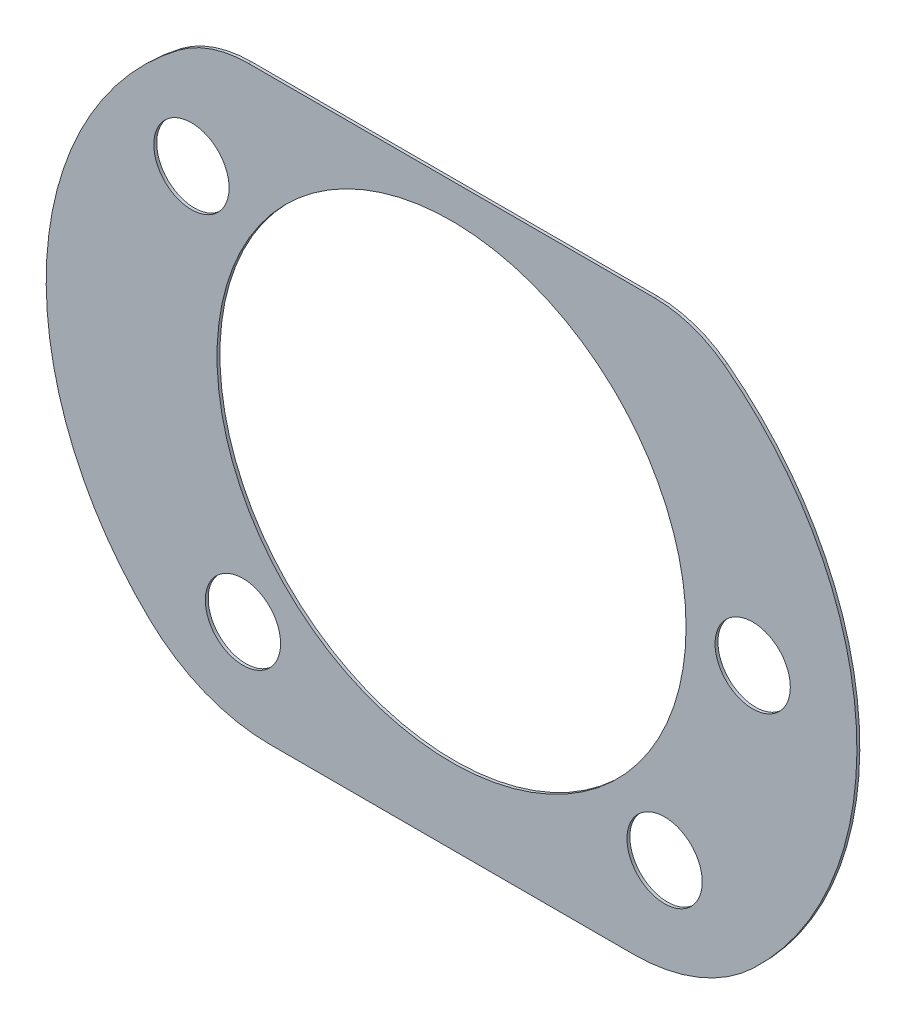
ISO-10303-21;
HEADER;
FILE_DESCRIPTION(('STEP AP214'),'2;1');
FILE_NAME('part.step','',(''),(''),'','','');
FILE_SCHEMA(('AUTOMOTIVE_DESIGN { 1 0 10303 214 1 1 1 1 }'));
ENDSEC;
DATA;
#1=APPLICATION_CONTEXT('core data for automotive mechanical design processes');
#2=APPLICATION_PROTOCOL_DEFINITION('international standard','automotive_design',2000,#1);
#3=PRODUCT_CONTEXT('',#1,'mechanical');
#4=PRODUCT('Part','Part','',(#3));
#5=PRODUCT_RELATED_PRODUCT_CATEGORY('part','',(#4));
#6=PRODUCT_DEFINITION_FORMATION('','',#4);
#7=PRODUCT_DEFINITION_CONTEXT('part definition',#1,'design');
#8=PRODUCT_DEFINITION('design','',#6,#7);
#9=PRODUCT_DEFINITION_SHAPE('','',#8);
#10=(LENGTH_UNIT() NAMED_UNIT(*) SI_UNIT(.MILLI.,.METRE.));
#11=(NAMED_UNIT(*) PLANE_ANGLE_UNIT() SI_UNIT($,.RADIAN.));
#12=(NAMED_UNIT(*) SI_UNIT($,.STERADIAN.) SOLID_ANGLE_UNIT());
#13=UNCERTAINTY_MEASURE_WITH_UNIT(LENGTH_MEASURE(1.E-05),#10,'distance_accuracy_value','');
#14=(GEOMETRIC_REPRESENTATION_CONTEXT(3) GLOBAL_UNCERTAINTY_ASSIGNED_CONTEXT((#13)) GLOBAL_UNIT_ASSIGNED_CONTEXT((#10,
#11,#12)) REPRESENTATION_CONTEXT('',''));
#15=CARTESIAN_POINT('',(0.,0.,0.));
#16=DIRECTION('',(0.,0.,1.));
#17=DIRECTION('',(1.,0.,0.));
#18=AXIS2_PLACEMENT_3D('',#15,#16,#17);
#19=CARTESIAN_POINT('',(12.3997988373471,-3.5,0.5));
#20=DIRECTION('',(0.,0.,1.));
#21=DIRECTION('',(1.,0.,0.));
#22=AXIS2_PLACEMENT_3D('',#19,#20,#21);
#23=PLANE('',#22);
#24=CARTESIAN_POINT('',(52.,0.,0.5));
#25=DIRECTION('',(0.,0.,1.));
#26=DIRECTION('',(1.,0.,0.));
#27=AXIS2_PLACEMENT_3D('',#24,#25,#26);
#28=CIRCLE('',#27,6.5);
#29=CARTESIAN_POINT('',(58.5,0.,0.5));
#30=VERTEX_POINT('',#29);
#31=EDGE_CURVE('E199',#30,#30,#28,.T.);
#32=ORIENTED_EDGE('',*,*,#31,.F.);
#33=EDGE_LOOP('',(#32));
#34=FACE_BOUND('',#33,.T.);
#35=CARTESIAN_POINT('',(-36.0242973560901,-37.5,0.5));
#36=DIRECTION('',(0.,0.,1.));
#37=DIRECTION('',(1.,0.,0.));
#38=AXIS2_PLACEMENT_3D('',#35,#36,#37);
#39=CIRCLE('',#38,6.5);
#40=CARTESIAN_POINT('',(-29.5242973560901,-37.5,0.5));
#41=VERTEX_POINT('',#40);
#42=EDGE_CURVE('E187',#41,#41,#39,.T.);
#43=ORIENTED_EDGE('',*,*,#42,.F.);
#44=EDGE_LOOP('',(#43));
#45=FACE_BOUND('',#44,.T.);
#46=CARTESIAN_POINT('',(12.3997988373471,-3.5,0.5));
#47=DIRECTION('',(0.,0.,1.));
#48=DIRECTION('',(1.,0.,0.));
#49=AXIS2_PLACEMENT_3D('',#46,#47,#48);
#50=CIRCLE('',#49,57.6);
#51=CARTESIAN_POINT('',(52.093689716507,-45.2391306434782,0.5));
#52=VERTEX_POINT('',#51);
#53=CARTESIAN_POINT('',(47.1226025392876,42.4574466553191,0.5));
#54=VERTEX_POINT('',#53);
#55=EDGE_CURVE('E150',#52,#54,#50,.T.);
#56=ORIENTED_EDGE('',*,*,#55,.T.);
#57=CARTESIAN_POINT('',(35.0660734761138,26.4999999,0.5));
#58=DIRECTION('',(0.,0.,1.));
#59=DIRECTION('',(1.,0.,0.));
#60=AXIS2_PLACEMENT_3D('',#57,#58,#59);
#61=CIRCLE('',#60,20.);
#62=CARTESIAN_POINT('',(35.0660734761138,46.4999999,0.5));
#63=VERTEX_POINT('',#62);
#64=EDGE_CURVE('E98',#54,#63,#61,.T.);
#65=ORIENTED_EDGE('',*,*,#64,.T.);
#66=DIRECTION('',(-1.,0.,0.));
#67=VECTOR('',#66,1.);
#68=CARTESIAN_POINT('',(35.0660734761138,46.4999999,0.5));
#69=LINE('',#68,#67);
#70=CARTESIAN_POINT('',(-35.0660734761138,46.4999999,0.5));
#71=VERTEX_POINT('',#70);
#72=EDGE_CURVE('E165',#63,#71,#69,.T.);
#73=ORIENTED_EDGE('',*,*,#72,.T.);
#74=CARTESIAN_POINT('',(-35.0660734761137,26.4965587331368,0.5));
#75=DIRECTION('',(0.,0.,1.));
#76=DIRECTION('',(1.,0.,0.));
#77=AXIS2_PLACEMENT_3D('',#74,#75,#76);
#78=CIRCLE('',#77,20.0034411668632);
#79=CARTESIAN_POINT('',(-47.1255088583811,42.4561225359816,0.5));
#80=VERTEX_POINT('',#79);
#81=EDGE_CURVE('E178',#71,#80,#78,.T.);
#82=ORIENTED_EDGE('',*,*,#81,.T.);
#83=CARTESIAN_POINT('',(-12.4003097176812,-3.49951416550181,0.5));
#84=DIRECTION('',(0.,0.,1.));
#85=DIRECTION('',(1.,0.,0.));
#86=AXIS2_PLACEMENT_3D('',#83,#84,#85);
#87=CIRCLE('',#86,57.6);
#88=CARTESIAN_POINT('',(-52.093134411796,-45.2396587244545,0.5));
#89=VERTEX_POINT('',#88);
#90=EDGE_CURVE('E117',#80,#89,#87,.T.);
#91=ORIENTED_EDGE('',*,*,#90,.T.);
#92=CARTESIAN_POINT('',(-31.4197882169445,-23.5000001,0.5));
#93=DIRECTION('',(0.,0.,1.));
#94=DIRECTION('',(1.,0.,0.));
#95=AXIS2_PLACEMENT_3D('',#92,#93,#94);
#96=CIRCLE('',#95,30.);
#97=CARTESIAN_POINT('',(-31.4197882169445,-53.5000001,0.5));
#98=VERTEX_POINT('',#97);
#99=EDGE_CURVE('E111',#89,#98,#96,.T.);
#100=ORIENTED_EDGE('',*,*,#99,.T.);
#101=DIRECTION('',(1.,0.,0.));
#102=VECTOR('',#101,1.);
#103=CARTESIAN_POINT('',(-31.4197882169445,-53.5000001,0.5));
#104=LINE('',#103,#102);
#105=CARTESIAN_POINT('',(31.4197882169446,-53.5000001,0.5));
#106=VERTEX_POINT('',#105);
#107=EDGE_CURVE('E115',#98,#106,#104,.T.);
#108=ORIENTED_EDGE('',*,*,#107,.T.);
#109=CARTESIAN_POINT('',(31.4197882169446,-23.5000001,0.5));
#110=DIRECTION('',(0.,0.,1.));
#111=DIRECTION('',(1.,0.,0.));
#112=AXIS2_PLACEMENT_3D('',#109,#110,#111);
#113=CIRCLE('',#112,30.);
#114=EDGE_CURVE('E55',#106,#52,#113,.T.);
#115=ORIENTED_EDGE('',*,*,#114,.T.);
#116=EDGE_LOOP('',(#56,#65,#73,#82,#91,#100,#108,#115));
#117=FACE_BOUND('',#116,.T.);
#118=CARTESIAN_POINT('',(-44.9172572626602,26.2,0.5));
#119=DIRECTION('',(0.,0.,1.));
#120=DIRECTION('',(1.,0.,0.));
#121=AXIS2_PLACEMENT_3D('',#118,#119,#120);
#122=CIRCLE('',#121,6.5);
#123=CARTESIAN_POINT('',(-38.4172572626602,26.2,0.5));
#124=VERTEX_POINT('',#123);
#125=EDGE_CURVE('E139',#124,#124,#122,.T.);
#126=ORIENTED_EDGE('',*,*,#125,.F.);
#127=EDGE_LOOP('',(#126));
#128=FACE_BOUND('',#127,.T.);
#129=CARTESIAN_POINT('',(36.7890948515997,-36.75,0.5));
#130=DIRECTION('',(0.,0.,1.));
#131=DIRECTION('',(1.,0.,0.));
#132=AXIS2_PLACEMENT_3D('',#129,#130,#131);
#133=CIRCLE('',#132,6.5);
#134=CARTESIAN_POINT('',(43.2890948515997,-36.75,0.5));
#135=VERTEX_POINT('',#134);
#136=EDGE_CURVE('E193',#135,#135,#133,.T.);
#137=ORIENTED_EDGE('',*,*,#136,.F.);
#138=EDGE_LOOP('',(#137));
#139=FACE_BOUND('',#138,.T.);
#140=CARTESIAN_POINT('',(0.,0.,0.5));
#141=DIRECTION('',(0.,0.,1.));
#142=DIRECTION('',(1.,0.,0.));
#143=AXIS2_PLACEMENT_3D('',#140,#141,#142);
#144=CIRCLE('',#143,40.5);
#145=CARTESIAN_POINT('',(40.5,0.,0.5));
#146=VERTEX_POINT('',#145);
#147=EDGE_CURVE('E205',#146,#146,#144,.T.);
#148=ORIENTED_EDGE('',*,*,#147,.F.);
#149=EDGE_LOOP('',(#148));
#150=FACE_BOUND('',#149,.T.);
#151=ADVANCED_FACE('F38',(#34,#45,#117,#128,#139,#150),#23,.T.);
#152=CARTESIAN_POINT('',(12.3997988373471,-3.5,0.));
#153=DIRECTION('',(0.,0.,1.));
#154=DIRECTION('',(1.,0.,0.));
#155=AXIS2_PLACEMENT_3D('',#152,#153,#154);
#156=PLANE('',#155);
#157=CARTESIAN_POINT('',(12.3997988373471,-3.5,0.));
#158=DIRECTION('',(0.,0.,1.));
#159=DIRECTION('',(1.,0.,0.));
#160=AXIS2_PLACEMENT_3D('',#157,#158,#159);
#161=CIRCLE('',#160,57.6);
#162=CARTESIAN_POINT('',(52.093689716507,-45.2391306434782,0.));
#163=VERTEX_POINT('',#162);
#164=CARTESIAN_POINT('',(47.1226025392876,42.4574466553191,0.));
#165=VERTEX_POINT('',#164);
#166=EDGE_CURVE('E135',#163,#165,#161,.T.);
#167=ORIENTED_EDGE('',*,*,#166,.F.);
#168=CARTESIAN_POINT('',(31.4197882169446,-23.5000001,0.));
#169=DIRECTION('',(0.,0.,1.));
#170=DIRECTION('',(1.,0.,0.));
#171=AXIS2_PLACEMENT_3D('',#168,#169,#170);
#172=CIRCLE('',#171,30.);
#173=CARTESIAN_POINT('',(31.4197882169446,-53.5000001,0.));
#174=VERTEX_POINT('',#173);
#175=EDGE_CURVE('E90',#174,#163,#172,.T.);
#176=ORIENTED_EDGE('',*,*,#175,.F.);
#177=DIRECTION('',(1.,0.,0.));
#178=VECTOR('',#177,1.);
#179=CARTESIAN_POINT('',(-31.4197882169445,-53.5000001,0.));
#180=LINE('',#179,#178);
#181=CARTESIAN_POINT('',(-31.4197882169445,-53.5000001,0.));
#182=VERTEX_POINT('',#181);
#183=EDGE_CURVE('E84',#182,#174,#180,.T.);
#184=ORIENTED_EDGE('',*,*,#183,.F.);
#185=CARTESIAN_POINT('',(-31.4197882169445,-23.5000001,0.));
#186=DIRECTION('',(0.,0.,1.));
#187=DIRECTION('',(1.,0.,0.));
#188=AXIS2_PLACEMENT_3D('',#185,#186,#187);
#189=CIRCLE('',#188,30.);
#190=CARTESIAN_POINT('',(-52.093134411796,-45.2396587244545,0.));
#191=VERTEX_POINT('',#190);
#192=EDGE_CURVE('E125',#191,#182,#189,.T.);
#193=ORIENTED_EDGE('',*,*,#192,.F.);
#194=CARTESIAN_POINT('',(-12.4003097176812,-3.49951416550181,0.));
#195=DIRECTION('',(0.,0.,1.));
#196=DIRECTION('',(1.,0.,0.));
#197=AXIS2_PLACEMENT_3D('',#194,#195,#196);
#198=CIRCLE('',#197,57.6);
#199=CARTESIAN_POINT('',(-47.1255088583811,42.4561225359816,0.));
#200=VERTEX_POINT('',#199);
#201=EDGE_CURVE('E145',#200,#191,#198,.T.);
#202=ORIENTED_EDGE('',*,*,#201,.F.);
#203=CARTESIAN_POINT('',(-35.0660734761137,26.4965587331368,0.));
#204=DIRECTION('',(0.,0.,1.));
#205=DIRECTION('',(1.,0.,0.));
#206=AXIS2_PLACEMENT_3D('',#203,#204,#205);
#207=CIRCLE('',#206,20.0034411668632);
#208=CARTESIAN_POINT('',(-35.0660734761138,46.4999999,0.));
#209=VERTEX_POINT('',#208);
#210=EDGE_CURVE('E143',#209,#200,#207,.T.);
#211=ORIENTED_EDGE('',*,*,#210,.F.);
#212=DIRECTION('',(-1.,0.,0.));
#213=VECTOR('',#212,1.);
#214=CARTESIAN_POINT('',(35.0660734761138,46.4999999,0.));
#215=LINE('',#214,#213);
#216=CARTESIAN_POINT('',(35.0660734761138,46.4999999,0.));
#217=VERTEX_POINT('',#216);
#218=EDGE_CURVE('E141',#217,#209,#215,.T.);
#219=ORIENTED_EDGE('',*,*,#218,.F.);
#220=CARTESIAN_POINT('',(35.0660734761138,26.4999999,0.));
#221=DIRECTION('',(0.,0.,1.));
#222=DIRECTION('',(1.,0.,0.));
#223=AXIS2_PLACEMENT_3D('',#220,#221,#222);
#224=CIRCLE('',#223,20.);
#225=EDGE_CURVE('E138',#165,#217,#224,.T.);
#226=ORIENTED_EDGE('',*,*,#225,.F.);
#227=EDGE_LOOP('',(#167,#176,#184,#193,#202,#211,#219,#226));
#228=FACE_BOUND('',#227,.T.);
#229=CARTESIAN_POINT('',(-44.9172572626602,26.2,0.));
#230=DIRECTION('',(0.,0.,1.));
#231=DIRECTION('',(1.,0.,0.));
#232=AXIS2_PLACEMENT_3D('',#229,#230,#231);
#233=CIRCLE('',#232,6.5);
#234=CARTESIAN_POINT('',(-38.4172572626602,26.2,0.));
#235=VERTEX_POINT('',#234);
#236=EDGE_CURVE('E184',#235,#235,#233,.T.);
#237=ORIENTED_EDGE('',*,*,#236,.T.);
#238=EDGE_LOOP('',(#237));
#239=FACE_BOUND('',#238,.T.);
#240=CARTESIAN_POINT('',(-36.0242973560901,-37.5,0.));
#241=DIRECTION('',(0.,0.,1.));
#242=DIRECTION('',(1.,0.,0.));
#243=AXIS2_PLACEMENT_3D('',#240,#241,#242);
#244=CIRCLE('',#243,6.5);
#245=CARTESIAN_POINT('',(-29.5242973560901,-37.5,0.));
#246=VERTEX_POINT('',#245);
#247=EDGE_CURVE('E190',#246,#246,#244,.T.);
#248=ORIENTED_EDGE('',*,*,#247,.T.);
#249=EDGE_LOOP('',(#248));
#250=FACE_BOUND('',#249,.T.);
#251=CARTESIAN_POINT('',(36.7890948515997,-36.75,0.));
#252=DIRECTION('',(0.,0.,1.));
#253=DIRECTION('',(1.,0.,0.));
#254=AXIS2_PLACEMENT_3D('',#251,#252,#253);
#255=CIRCLE('',#254,6.5);
#256=CARTESIAN_POINT('',(43.2890948515997,-36.75,0.));
#257=VERTEX_POINT('',#256);
#258=EDGE_CURVE('E196',#257,#257,#255,.T.);
#259=ORIENTED_EDGE('',*,*,#258,.T.);
#260=EDGE_LOOP('',(#259));
#261=FACE_BOUND('',#260,.T.);
#262=CARTESIAN_POINT('',(52.,0.,0.));
#263=DIRECTION('',(0.,0.,1.));
#264=DIRECTION('',(1.,0.,0.));
#265=AXIS2_PLACEMENT_3D('',#262,#263,#264);
#266=CIRCLE('',#265,6.5);
#267=CARTESIAN_POINT('',(58.5,0.,0.));
#268=VERTEX_POINT('',#267);
#269=EDGE_CURVE('E202',#268,#268,#266,.T.);
#270=ORIENTED_EDGE('',*,*,#269,.T.);
#271=EDGE_LOOP('',(#270));
#272=FACE_BOUND('',#271,.T.);
#273=CARTESIAN_POINT('',(0.,0.,0.));
#274=DIRECTION('',(0.,0.,1.));
#275=DIRECTION('',(1.,0.,0.));
#276=AXIS2_PLACEMENT_3D('',#273,#274,#275);
#277=CIRCLE('',#276,40.5);
#278=CARTESIAN_POINT('',(40.5,0.,0.));
#279=VERTEX_POINT('',#278);
#280=EDGE_CURVE('E208',#279,#279,#277,.T.);
#281=ORIENTED_EDGE('',*,*,#280,.T.);
#282=EDGE_LOOP('',(#281));
#283=FACE_BOUND('',#282,.T.);
#284=ADVANCED_FACE('F169',(#228,#239,#250,#261,#272,#283),#156,.F.);
#285=CARTESIAN_POINT('',(12.3997988373471,-3.5,0.5));
#286=DIRECTION('',(0.,0.,-1.));
#287=DIRECTION('',(-1.,0.,0.));
#288=AXIS2_PLACEMENT_3D('',#285,#286,#287);
#289=CYLINDRICAL_SURFACE('',#288,57.6);
#290=ORIENTED_EDGE('',*,*,#166,.T.);
#291=DIRECTION('',(0.,0.,-1.));
#292=VECTOR('',#291,1.);
#293=CARTESIAN_POINT('',(47.1226025392876,42.4574466553191,0.5));
#294=LINE('',#293,#292);
#295=EDGE_CURVE('E11',#54,#165,#294,.T.);
#296=ORIENTED_EDGE('',*,*,#295,.F.);
#297=ORIENTED_EDGE('',*,*,#55,.F.);
#298=DIRECTION('',(0.,0.,-1.));
#299=VECTOR('',#298,1.);
#300=CARTESIAN_POINT('',(52.093689716507,-45.2391306434782,0.5));
#301=LINE('',#300,#299);
#302=EDGE_CURVE('E131',#52,#163,#301,.T.);
#303=ORIENTED_EDGE('',*,*,#302,.T.);
#304=EDGE_LOOP('',(#290,#296,#297,#303));
#305=FACE_BOUND('',#304,.T.);
#306=ADVANCED_FACE('F40',(#305),#289,.T.);
#307=CARTESIAN_POINT('',(35.0660734761138,26.4999999,0.5));
#308=DIRECTION('',(0.,0.,-1.));
#309=DIRECTION('',(-1.,0.,0.));
#310=AXIS2_PLACEMENT_3D('',#307,#308,#309);
#311=CYLINDRICAL_SURFACE('',#310,20.);
#312=ORIENTED_EDGE('',*,*,#225,.T.);
#313=DIRECTION('',(0.,0.,-1.));
#314=VECTOR('',#313,1.);
#315=CARTESIAN_POINT('',(35.0660734761138,46.4999999,0.5));
#316=LINE('',#315,#314);
#317=EDGE_CURVE('E47',#63,#217,#316,.T.);
#318=ORIENTED_EDGE('',*,*,#317,.F.);
#319=ORIENTED_EDGE('',*,*,#64,.F.);
#320=ORIENTED_EDGE('',*,*,#295,.T.);
#321=EDGE_LOOP('',(#312,#318,#319,#320));
#322=FACE_BOUND('',#321,.T.);
#323=ADVANCED_FACE('F242',(#322),#311,.T.);
#324=CARTESIAN_POINT('',(35.0660734761138,46.4999999,0.5));
#325=DIRECTION('',(0.,-1.,0.));
#326=DIRECTION('',(1.,0.,0.));
#327=AXIS2_PLACEMENT_3D('',#324,#325,#326);
#328=PLANE('',#327);
#329=ORIENTED_EDGE('',*,*,#218,.T.);
#330=DIRECTION('',(0.,0.,-1.));
#331=VECTOR('',#330,1.);
#332=CARTESIAN_POINT('',(-35.0660734761138,46.4999999,0.5));
#333=LINE('',#332,#331);
#334=EDGE_CURVE('E157',#71,#209,#333,.T.);
#335=ORIENTED_EDGE('',*,*,#334,.F.);
#336=ORIENTED_EDGE('',*,*,#72,.F.);
#337=ORIENTED_EDGE('',*,*,#317,.T.);
#338=EDGE_LOOP('',(#329,#335,#336,#337));
#339=FACE_BOUND('',#338,.T.);
#340=ADVANCED_FACE('F163',(#339),#328,.F.);
#341=CARTESIAN_POINT('',(-35.0660734761137,26.4965587331368,0.5));
#342=DIRECTION('',(0.,0.,-1.));
#343=DIRECTION('',(-1.,0.,0.));
#344=AXIS2_PLACEMENT_3D('',#341,#342,#343);
#345=CYLINDRICAL_SURFACE('',#344,20.0034411668632);
#346=ORIENTED_EDGE('',*,*,#210,.T.);
#347=DIRECTION('',(0.,0.,-1.));
#348=VECTOR('',#347,1.);
#349=CARTESIAN_POINT('',(-47.1255088583811,42.4561225359816,0.5));
#350=LINE('',#349,#348);
#351=EDGE_CURVE('E154',#80,#200,#350,.T.);
#352=ORIENTED_EDGE('',*,*,#351,.F.);
#353=ORIENTED_EDGE('',*,*,#81,.F.);
#354=ORIENTED_EDGE('',*,*,#334,.T.);
#355=EDGE_LOOP('',(#346,#352,#353,#354));
#356=FACE_BOUND('',#355,.T.);
#357=ADVANCED_FACE('F174',(#356),#345,.T.);
#358=CARTESIAN_POINT('',(-12.4003097176812,-3.49951416550181,0.5));
#359=DIRECTION('',(0.,0.,-1.));
#360=DIRECTION('',(-1.,0.,0.));
#361=AXIS2_PLACEMENT_3D('',#358,#359,#360);
#362=CYLINDRICAL_SURFACE('',#361,57.6);
#363=ORIENTED_EDGE('',*,*,#201,.T.);
#364=DIRECTION('',(0.,0.,-1.));
#365=VECTOR('',#364,1.);
#366=CARTESIAN_POINT('',(-52.093134411796,-45.2396587244545,0.5));
#367=LINE('',#366,#365);
#368=EDGE_CURVE('E126',#89,#191,#367,.T.);
#369=ORIENTED_EDGE('',*,*,#368,.F.);
#370=ORIENTED_EDGE('',*,*,#90,.F.);
#371=ORIENTED_EDGE('',*,*,#351,.T.);
#372=EDGE_LOOP('',(#363,#369,#370,#371));
#373=FACE_BOUND('',#372,.T.);
#374=ADVANCED_FACE('F177',(#373),#362,.T.);
#375=CARTESIAN_POINT('',(-31.4197882169445,-23.5000001,0.5));
#376=DIRECTION('',(0.,0.,-1.));
#377=DIRECTION('',(-1.,0.,0.));
#378=AXIS2_PLACEMENT_3D('',#375,#376,#377);
#379=CYLINDRICAL_SURFACE('',#378,30.);
#380=ORIENTED_EDGE('',*,*,#192,.T.);
#381=DIRECTION('',(0.,0.,-1.));
#382=VECTOR('',#381,1.);
#383=CARTESIAN_POINT('',(-31.4197882169445,-53.5000001,0.5));
#384=LINE('',#383,#382);
#385=EDGE_CURVE('E122',#98,#182,#384,.T.);
#386=ORIENTED_EDGE('',*,*,#385,.F.);
#387=ORIENTED_EDGE('',*,*,#99,.F.);
#388=ORIENTED_EDGE('',*,*,#368,.T.);
#389=EDGE_LOOP('',(#380,#386,#387,#388));
#390=FACE_BOUND('',#389,.T.);
#391=ADVANCED_FACE('F123',(#390),#379,.T.);
#392=CARTESIAN_POINT('',(-31.4197882169445,-53.5000001,0.5));
#393=DIRECTION('',(0.,1.,0.));
#394=DIRECTION('',(-1.,0.,0.));
#395=AXIS2_PLACEMENT_3D('',#392,#393,#394);
#396=PLANE('',#395);
#397=ORIENTED_EDGE('',*,*,#183,.T.);
#398=DIRECTION('',(0.,0.,-1.));
#399=VECTOR('',#398,1.);
#400=CARTESIAN_POINT('',(31.4197882169446,-53.5000001,0.5));
#401=LINE('',#400,#399);
#402=EDGE_CURVE('E127',#106,#174,#401,.T.);
#403=ORIENTED_EDGE('',*,*,#402,.F.);
#404=ORIENTED_EDGE('',*,*,#107,.F.);
#405=ORIENTED_EDGE('',*,*,#385,.T.);
#406=EDGE_LOOP('',(#397,#403,#404,#405));
#407=FACE_BOUND('',#406,.T.);
#408=ADVANCED_FACE('F129',(#407),#396,.F.);
#409=CARTESIAN_POINT('',(31.4197882169446,-23.5000001,0.5));
#410=DIRECTION('',(0.,0.,-1.));
#411=DIRECTION('',(-1.,0.,0.));
#412=AXIS2_PLACEMENT_3D('',#409,#410,#411);
#413=CYLINDRICAL_SURFACE('',#412,30.);
#414=ORIENTED_EDGE('',*,*,#175,.T.);
#415=ORIENTED_EDGE('',*,*,#302,.F.);
#416=ORIENTED_EDGE('',*,*,#114,.F.);
#417=ORIENTED_EDGE('',*,*,#402,.T.);
#418=EDGE_LOOP('',(#414,#415,#416,#417));
#419=FACE_BOUND('',#418,.T.);
#420=ADVANCED_FACE('F230',(#419),#413,.T.);
#421=CARTESIAN_POINT('',(-44.9172572626602,26.2,0.5));
#422=DIRECTION('',(0.,0.,-1.));
#423=DIRECTION('',(-1.,0.,0.));
#424=AXIS2_PLACEMENT_3D('',#421,#422,#423);
#425=CYLINDRICAL_SURFACE('',#424,6.5);
#426=ORIENTED_EDGE('',*,*,#125,.T.);
#427=EDGE_LOOP('',(#426));
#428=FACE_BOUND('',#427,.T.);
#429=ORIENTED_EDGE('',*,*,#236,.F.);
#430=EDGE_LOOP('',(#429));
#431=FACE_BOUND('',#430,.T.);
#432=ADVANCED_FACE('F227',(#428,#431),#425,.F.);
#433=CARTESIAN_POINT('',(-36.0242973560901,-37.5,0.5));
#434=DIRECTION('',(0.,0.,-1.));
#435=DIRECTION('',(-1.,0.,0.));
#436=AXIS2_PLACEMENT_3D('',#433,#434,#435);
#437=CYLINDRICAL_SURFACE('',#436,6.5);
#438=ORIENTED_EDGE('',*,*,#42,.T.);
#439=EDGE_LOOP('',(#438));
#440=FACE_BOUND('',#439,.T.);
#441=ORIENTED_EDGE('',*,*,#247,.F.);
#442=EDGE_LOOP('',(#441));
#443=FACE_BOUND('',#442,.T.);
#444=ADVANCED_FACE('F291',(#440,#443),#437,.F.);
#445=CARTESIAN_POINT('',(36.7890948515997,-36.75,0.5));
#446=DIRECTION('',(0.,0.,-1.));
#447=DIRECTION('',(-1.,0.,0.));
#448=AXIS2_PLACEMENT_3D('',#445,#446,#447);
#449=CYLINDRICAL_SURFACE('',#448,6.5);
#450=ORIENTED_EDGE('',*,*,#136,.T.);
#451=EDGE_LOOP('',(#450));
#452=FACE_BOUND('',#451,.T.);
#453=ORIENTED_EDGE('',*,*,#258,.F.);
#454=EDGE_LOOP('',(#453));
#455=FACE_BOUND('',#454,.T.);
#456=ADVANCED_FACE('F298',(#452,#455),#449,.F.);
#457=CARTESIAN_POINT('',(52.,0.,0.5));
#458=DIRECTION('',(0.,0.,-1.));
#459=DIRECTION('',(-1.,0.,0.));
#460=AXIS2_PLACEMENT_3D('',#457,#458,#459);
#461=CYLINDRICAL_SURFACE('',#460,6.5);
#462=ORIENTED_EDGE('',*,*,#31,.T.);
#463=EDGE_LOOP('',(#462));
#464=FACE_BOUND('',#463,.T.);
#465=ORIENTED_EDGE('',*,*,#269,.F.);
#466=EDGE_LOOP('',(#465));
#467=FACE_BOUND('',#466,.T.);
#468=ADVANCED_FACE('F305',(#464,#467),#461,.F.);
#469=CARTESIAN_POINT('',(0.,0.,0.5));
#470=DIRECTION('',(0.,0.,-1.));
#471=DIRECTION('',(-1.,0.,0.));
#472=AXIS2_PLACEMENT_3D('',#469,#470,#471);
#473=CYLINDRICAL_SURFACE('',#472,40.5);
#474=ORIENTED_EDGE('',*,*,#147,.T.);
#475=EDGE_LOOP('',(#474));
#476=FACE_BOUND('',#475,.T.);
#477=ORIENTED_EDGE('',*,*,#280,.F.);
#478=EDGE_LOOP('',(#477));
#479=FACE_BOUND('',#478,.T.);
#480=ADVANCED_FACE('F214',(#476,#479),#473,.F.);
#481=CLOSED_SHELL('',(#151,#284,#306,#323,#340,#357,#374,#391,#408,#420,#432,#444,#456,#468,#480));
#482=MANIFOLD_SOLID_BREP('B2',#481);
#483=ADVANCED_BREP_SHAPE_REPRESENTATION('',(#18,#482),#14);
#484=SHAPE_DEFINITION_REPRESENTATION(#9,#483);
ENDSEC;
END-ISO-10303-21;
